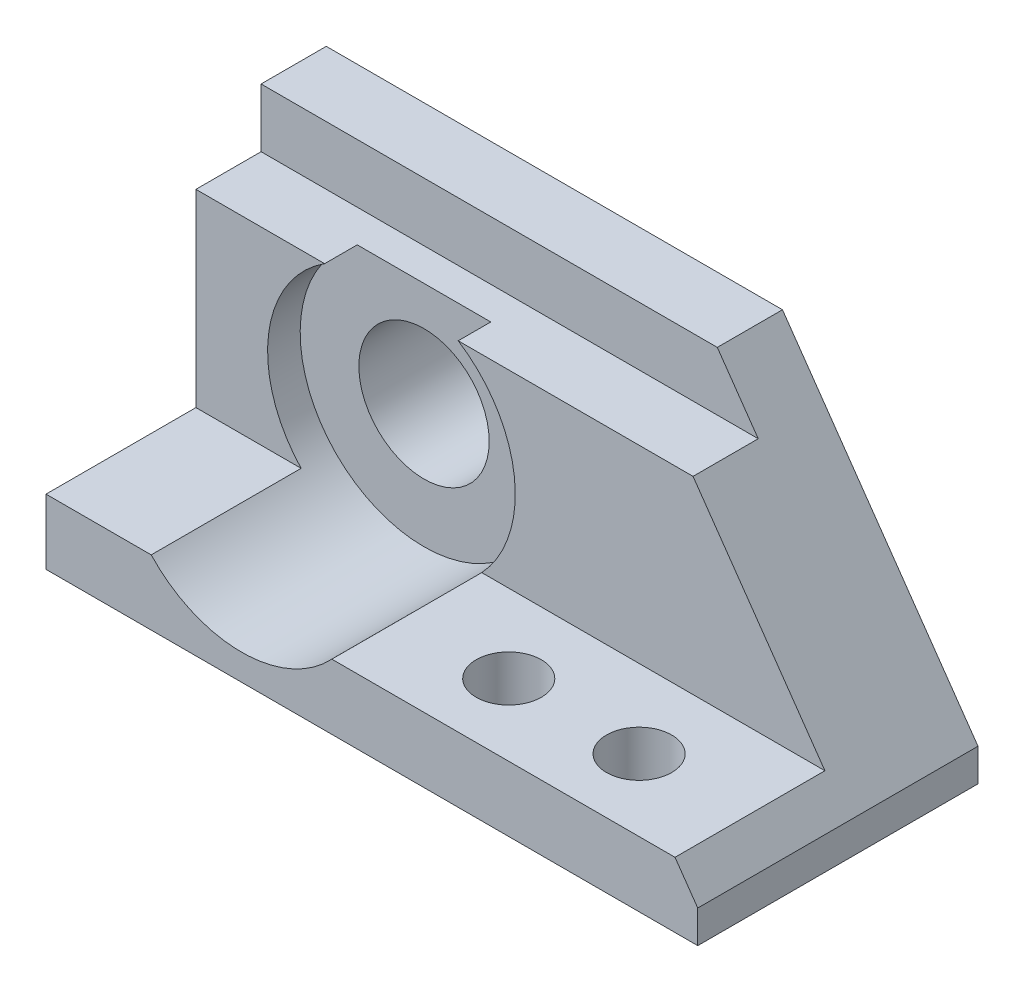
ISO-10303-21;
HEADER;
FILE_DESCRIPTION(('STEP AP214'),'2;1');
FILE_NAME('part.step','',(''),(''),'','','');
FILE_SCHEMA(('AUTOMOTIVE_DESIGN { 1 0 10303 214 1 1 1 1 }'));
ENDSEC;
DATA;
#1=APPLICATION_CONTEXT('core data for automotive mechanical design processes');
#2=APPLICATION_PROTOCOL_DEFINITION('international standard','automotive_design',2000,#1);
#3=PRODUCT_CONTEXT('',#1,'mechanical');
#4=PRODUCT('Part','Part','',(#3));
#5=PRODUCT_RELATED_PRODUCT_CATEGORY('part','',(#4));
#6=PRODUCT_DEFINITION_FORMATION('','',#4);
#7=PRODUCT_DEFINITION_CONTEXT('part definition',#1,'design');
#8=PRODUCT_DEFINITION('design','',#6,#7);
#9=PRODUCT_DEFINITION_SHAPE('','',#8);
#10=(LENGTH_UNIT() NAMED_UNIT(*) SI_UNIT(.MILLI.,.METRE.));
#11=(NAMED_UNIT(*) PLANE_ANGLE_UNIT() SI_UNIT($,.RADIAN.));
#12=(NAMED_UNIT(*) SI_UNIT($,.STERADIAN.) SOLID_ANGLE_UNIT());
#13=UNCERTAINTY_MEASURE_WITH_UNIT(LENGTH_MEASURE(1.E-05),#10,'distance_accuracy_value','');
#14=(GEOMETRIC_REPRESENTATION_CONTEXT(3) GLOBAL_UNCERTAINTY_ASSIGNED_CONTEXT((#13)) GLOBAL_UNIT_ASSIGNED_CONTEXT((#10,
#11,#12)) REPRESENTATION_CONTEXT('',''));
#15=CARTESIAN_POINT('',(0.,0.,0.));
#16=DIRECTION('',(0.,0.,1.));
#17=DIRECTION('',(1.,0.,0.));
#18=AXIS2_PLACEMENT_3D('',#15,#16,#17);
#19=CARTESIAN_POINT('',(100.,39.,20.));
#20=DIRECTION('',(0.,-1.,0.));
#21=DIRECTION('',(0.,0.,-1.));
#22=AXIS2_PLACEMENT_3D('',#19,#20,#21);
#23=PLANE('',#22);
#24=DIRECTION('',(0.,0.,1.));
#25=VECTOR('',#24,1.);
#26=CARTESIAN_POINT('',(40.2469507659596,39.,15.));
#27=LINE('',#26,#25);
#28=CARTESIAN_POINT('',(40.2469507659596,39.,20.));
#29=VERTEX_POINT('',#28);
#30=CARTESIAN_POINT('',(40.2469507659596,39.,15.));
#31=VERTEX_POINT('',#30);
#32=EDGE_CURVE('E141',#29,#31,#27,.F.);
#33=ORIENTED_EDGE('',*,*,#32,.F.);
#34=DIRECTION('',(-1.,0.,0.));
#35=VECTOR('',#34,1.);
#36=CARTESIAN_POINT('',(100.,39.,20.));
#37=LINE('',#36,#35);
#38=CARTESIAN_POINT('',(76.2790697674419,39.,20.));
#39=VERTEX_POINT('',#38);
#40=EDGE_CURVE('E219',#39,#29,#37,.T.);
#41=ORIENTED_EDGE('',*,*,#40,.F.);
#42=DIRECTION('',(0.,0.,1.));
#43=VECTOR('',#42,1.);
#44=CARTESIAN_POINT('',(76.2790697674419,39.,20.));
#45=LINE('',#44,#43);
#46=CARTESIAN_POINT('',(76.2790697674419,39.,10.));
#47=VERTEX_POINT('',#46);
#48=EDGE_CURVE('E171',#47,#39,#45,.T.);
#49=ORIENTED_EDGE('',*,*,#48,.F.);
#50=DIRECTION('',(-1.,0.,0.));
#51=VECTOR('',#50,1.);
#52=CARTESIAN_POINT('',(100.,39.,10.));
#53=LINE('',#52,#51);
#54=CARTESIAN_POINT('',(0.,39.,10.));
#55=VERTEX_POINT('',#54);
#56=EDGE_CURVE('E222',#47,#55,#53,.T.);
#57=ORIENTED_EDGE('',*,*,#56,.T.);
#58=DIRECTION('',(0.,0.,1.));
#59=VECTOR('',#58,1.);
#60=CARTESIAN_POINT('',(0.,39.,20.));
#61=LINE('',#60,#59);
#62=CARTESIAN_POINT('',(0.,39.,20.));
#63=VERTEX_POINT('',#62);
#64=EDGE_CURVE('E190',#55,#63,#61,.T.);
#65=ORIENTED_EDGE('',*,*,#64,.T.);
#66=CARTESIAN_POINT('',(19.7530492340404,39.,20.));
#67=VERTEX_POINT('',#66);
#68=EDGE_CURVE('E146',#67,#63,#37,.T.);
#69=ORIENTED_EDGE('',*,*,#68,.F.);
#70=DIRECTION('',(0.,0.,1.));
#71=VECTOR('',#70,1.);
#72=CARTESIAN_POINT('',(19.7530492340404,39.,15.));
#73=LINE('',#72,#71);
#74=CARTESIAN_POINT('',(19.7530492340404,39.,15.));
#75=VERTEX_POINT('',#74);
#76=EDGE_CURVE('E139',#75,#67,#73,.T.);
#77=ORIENTED_EDGE('',*,*,#76,.F.);
#78=DIRECTION('',(1.,0.,0.));
#79=VECTOR('',#78,1.);
#80=CARTESIAN_POINT('',(100.,39.,15.));
#81=LINE('',#80,#79);
#82=EDGE_CURVE('E11',#75,#31,#81,.T.);
#83=ORIENTED_EDGE('',*,*,#82,.T.);
#84=EDGE_LOOP('',(#33,#41,#49,#57,#65,#69,#77,#83));
#85=FACE_BOUND('',#84,.T.);
#86=ADVANCED_FACE('F37',(#85),#23,.F.);
#87=CARTESIAN_POINT('',(100.,10.,20.));
#88=DIRECTION('',(0.,0.,-1.));
#89=DIRECTION('',(-1.,0.,0.));
#90=AXIS2_PLACEMENT_3D('',#87,#88,#89);
#91=PLANE('',#90);
#92=CARTESIAN_POINT('',(30.,23.,20.));
#93=DIRECTION('',(0.,0.,-1.));
#94=DIRECTION('',(-1.,0.,0.));
#95=AXIS2_PLACEMENT_3D('',#92,#93,#94);
#96=CIRCLE('',#95,19.);
#97=CARTESIAN_POINT('',(43.856406460551,10.,20.));
#98=VERTEX_POINT('',#97);
#99=EDGE_CURVE('E150',#98,#29,#96,.F.);
#100=ORIENTED_EDGE('',*,*,#99,.F.);
#101=DIRECTION('',(-1.,0.,0.));
#102=VECTOR('',#101,1.);
#103=CARTESIAN_POINT('',(100.,10.,20.));
#104=LINE('',#103,#102);
#105=CARTESIAN_POINT('',(96.5116279069767,10.,20.));
#106=VERTEX_POINT('',#105);
#107=EDGE_CURVE('E216',#106,#98,#104,.T.);
#108=ORIENTED_EDGE('',*,*,#107,.F.);
#109=DIRECTION('',(0.572181596024081,-0.820126954301183,0.));
#110=VECTOR('',#109,1.);
#111=CARTESIAN_POINT('',(97.6536922517279,8.36304110585667,20.));
#112=LINE('',#111,#110);
#113=EDGE_CURVE('E168',#39,#106,#112,.T.);
#114=ORIENTED_EDGE('',*,*,#113,.F.);
#115=ORIENTED_EDGE('',*,*,#40,.T.);
#116=EDGE_LOOP('',(#100,#108,#114,#115));
#117=FACE_BOUND('',#116,.T.);
#118=ADVANCED_FACE('F256',(#117),#91,.F.);
#119=CARTESIAN_POINT('',(100.,10.,43.));
#120=DIRECTION('',(0.,-1.,0.));
#121=DIRECTION('',(0.,0.,-1.));
#122=AXIS2_PLACEMENT_3D('',#119,#120,#121);
#123=PLANE('',#122);
#124=CARTESIAN_POINT('',(80.,10.,32.));
#125=DIRECTION('',(0.,1.,0.));
#126=DIRECTION('',(0.,0.,1.));
#127=AXIS2_PLACEMENT_3D('',#124,#125,#126);
#128=CIRCLE('',#127,4.99999999999999);
#129=CARTESIAN_POINT('',(80.,10.,37.));
#130=VERTEX_POINT('',#129);
#131=EDGE_CURVE('E473',#130,#130,#128,.T.);
#132=ORIENTED_EDGE('',*,*,#131,.F.);
#133=EDGE_LOOP('',(#132));
#134=FACE_BOUND('',#133,.T.);
#135=CARTESIAN_POINT('',(60.,10.,32.));
#136=DIRECTION('',(0.,1.,0.));
#137=DIRECTION('',(0.,0.,1.));
#138=AXIS2_PLACEMENT_3D('',#135,#136,#137);
#139=CIRCLE('',#138,4.99999999999999);
#140=CARTESIAN_POINT('',(60.,10.,37.));
#141=VERTEX_POINT('',#140);
#142=EDGE_CURVE('E458',#141,#141,#139,.T.);
#143=ORIENTED_EDGE('',*,*,#142,.F.);
#144=EDGE_LOOP('',(#143));
#145=FACE_BOUND('',#144,.T.);
#146=DIRECTION('',(0.,0.,1.));
#147=VECTOR('',#146,1.);
#148=CARTESIAN_POINT('',(43.856406460551,10.,15.));
#149=LINE('',#148,#147);
#150=CARTESIAN_POINT('',(43.856406460551,10.,43.));
#151=VERTEX_POINT('',#150);
#152=EDGE_CURVE('E147',#151,#98,#149,.F.);
#153=ORIENTED_EDGE('',*,*,#152,.F.);
#154=DIRECTION('',(-1.,0.,0.));
#155=VECTOR('',#154,1.);
#156=CARTESIAN_POINT('',(100.,10.,43.));
#157=LINE('',#156,#155);
#158=CARTESIAN_POINT('',(96.5116279069767,10.,43.));
#159=VERTEX_POINT('',#158);
#160=EDGE_CURVE('E212',#159,#151,#157,.T.);
#161=ORIENTED_EDGE('',*,*,#160,.F.);
#162=DIRECTION('',(0.,0.,1.));
#163=VECTOR('',#162,1.);
#164=CARTESIAN_POINT('',(96.5116279069767,10.,43.));
#165=LINE('',#164,#163);
#166=EDGE_CURVE('E165',#106,#159,#165,.T.);
#167=ORIENTED_EDGE('',*,*,#166,.F.);
#168=ORIENTED_EDGE('',*,*,#107,.T.);
#169=EDGE_LOOP('',(#153,#161,#167,#168));
#170=FACE_BOUND('',#169,.T.);
#171=ADVANCED_FACE('F259',(#134,#145,#170),#123,.F.);
#172=DIRECTION('',(0.,0.,1.));
#173=VECTOR('',#172,1.);
#174=CARTESIAN_POINT('',(16.143593539449,10.,15.));
#175=LINE('',#174,#173);
#176=CARTESIAN_POINT('',(16.143593539449,10.,20.));
#177=VERTEX_POINT('',#176);
#178=CARTESIAN_POINT('',(16.143593539449,10.,43.));
#179=VERTEX_POINT('',#178);
#180=EDGE_CURVE('E52',#177,#179,#175,.T.);
#181=ORIENTED_EDGE('',*,*,#180,.F.);
#182=CARTESIAN_POINT('',(0.,10.,20.));
#183=VERTEX_POINT('',#182);
#184=EDGE_CURVE('E215',#177,#183,#104,.T.);
#185=ORIENTED_EDGE('',*,*,#184,.T.);
#186=DIRECTION('',(0.,0.,1.));
#187=VECTOR('',#186,1.);
#188=CARTESIAN_POINT('',(0.,10.,43.));
#189=LINE('',#188,#187);
#190=CARTESIAN_POINT('',(0.,10.,43.));
#191=VERTEX_POINT('',#190);
#192=EDGE_CURVE('E195',#183,#191,#189,.T.);
#193=ORIENTED_EDGE('',*,*,#192,.T.);
#194=EDGE_CURVE('E211',#179,#191,#157,.T.);
#195=ORIENTED_EDGE('',*,*,#194,.F.);
#196=EDGE_LOOP('',(#181,#185,#193,#195));
#197=FACE_BOUND('',#196,.T.);
#198=ADVANCED_FACE('F265',(#197),#123,.F.);
#199=CARTESIAN_POINT('',(100.,0.,0.));
#200=DIRECTION('',(-1.,0.,0.));
#201=DIRECTION('',(0.,0.,1.));
#202=AXIS2_PLACEMENT_3D('',#199,#200,#201);
#203=PLANE('',#202);
#204=DIRECTION('',(0.,0.,-1.));
#205=VECTOR('',#204,1.);
#206=CARTESIAN_POINT('',(100.,5.,161.207977257442));
#207=LINE('',#206,#205);
#208=CARTESIAN_POINT('',(100.,4.99999999999998,43.));
#209=VERTEX_POINT('',#208);
#210=CARTESIAN_POINT('',(100.,5.,0.));
#211=VERTEX_POINT('',#210);
#212=EDGE_CURVE('E157',#209,#211,#207,.T.);
#213=ORIENTED_EDGE('',*,*,#212,.F.);
#214=DIRECTION('',(0.,-1.,0.));
#215=VECTOR('',#214,1.);
#216=CARTESIAN_POINT('',(100.,0.,43.));
#217=LINE('',#216,#215);
#218=CARTESIAN_POINT('',(100.,0.,43.));
#219=VERTEX_POINT('',#218);
#220=EDGE_CURVE('E176',#209,#219,#217,.T.);
#221=ORIENTED_EDGE('',*,*,#220,.T.);
#222=DIRECTION('',(0.,0.,-1.));
#223=VECTOR('',#222,1.);
#224=CARTESIAN_POINT('',(100.,0.,0.));
#225=LINE('',#224,#223);
#226=CARTESIAN_POINT('',(100.,0.,0.));
#227=VERTEX_POINT('',#226);
#228=EDGE_CURVE('E178',#219,#227,#225,.T.);
#229=ORIENTED_EDGE('',*,*,#228,.T.);
#230=DIRECTION('',(0.,1.,0.));
#231=VECTOR('',#230,1.);
#232=CARTESIAN_POINT('',(100.,48.,0.));
#233=LINE('',#232,#231);
#234=EDGE_CURVE('E181',#227,#211,#233,.T.);
#235=ORIENTED_EDGE('',*,*,#234,.T.);
#236=EDGE_LOOP('',(#213,#221,#229,#235));
#237=FACE_BOUND('',#236,.T.);
#238=ADVANCED_FACE('F233',(#237),#203,.F.);
#239=CARTESIAN_POINT('',(100.,39.,10.));
#240=DIRECTION('',(0.,0.,-1.));
#241=DIRECTION('',(-1.,0.,0.));
#242=AXIS2_PLACEMENT_3D('',#239,#240,#241);
#243=PLANE('',#242);
#244=DIRECTION('',(0.572181596024081,-0.820126954301183,0.));
#245=VECTOR('',#244,1.);
#246=CARTESIAN_POINT('',(84.0451073117497,27.8686795198254,10.));
#247=LINE('',#246,#245);
#248=CARTESIAN_POINT('',(70.,48.,10.));
#249=VERTEX_POINT('',#248);
#250=EDGE_CURVE('E60',#249,#47,#247,.T.);
#251=ORIENTED_EDGE('',*,*,#250,.F.);
#252=DIRECTION('',(-1.,0.,0.));
#253=VECTOR('',#252,1.);
#254=CARTESIAN_POINT('',(100.,48.,10.));
#255=LINE('',#254,#253);
#256=CARTESIAN_POINT('',(0.,48.,10.));
#257=VERTEX_POINT('',#256);
#258=EDGE_CURVE('E224',#249,#257,#255,.T.);
#259=ORIENTED_EDGE('',*,*,#258,.T.);
#260=DIRECTION('',(0.,-1.,0.));
#261=VECTOR('',#260,1.);
#262=CARTESIAN_POINT('',(0.,39.,10.));
#263=LINE('',#262,#261);
#264=EDGE_CURVE('E187',#257,#55,#263,.T.);
#265=ORIENTED_EDGE('',*,*,#264,.T.);
#266=ORIENTED_EDGE('',*,*,#56,.F.);
#267=EDGE_LOOP('',(#251,#259,#265,#266));
#268=FACE_BOUND('',#267,.T.);
#269=ADVANCED_FACE('F249',(#268),#243,.F.);
#270=EDGE_CURVE('E148',#67,#177,#96,.F.);
#271=ORIENTED_EDGE('',*,*,#270,.F.);
#272=ORIENTED_EDGE('',*,*,#68,.T.);
#273=DIRECTION('',(0.,-1.,0.));
#274=VECTOR('',#273,1.);
#275=CARTESIAN_POINT('',(0.,10.,20.));
#276=LINE('',#275,#274);
#277=EDGE_CURVE('E192',#63,#183,#276,.T.);
#278=ORIENTED_EDGE('',*,*,#277,.T.);
#279=ORIENTED_EDGE('',*,*,#184,.F.);
#280=EDGE_LOOP('',(#271,#272,#278,#279));
#281=FACE_BOUND('',#280,.T.);
#282=ADVANCED_FACE('F268',(#281),#91,.F.);
#283=CARTESIAN_POINT('',(100.,0.,43.));
#284=DIRECTION('',(0.,0.,-1.));
#285=DIRECTION('',(-1.,0.,0.));
#286=AXIS2_PLACEMENT_3D('',#283,#284,#285);
#287=PLANE('',#286);
#288=CARTESIAN_POINT('',(30.,23.,43.));
#289=DIRECTION('',(0.,0.,-1.));
#290=DIRECTION('',(-1.,0.,0.));
#291=AXIS2_PLACEMENT_3D('',#288,#289,#290);
#292=CIRCLE('',#291,19.);
#293=EDGE_CURVE('E142',#151,#179,#292,.T.);
#294=ORIENTED_EDGE('',*,*,#293,.T.);
#295=ORIENTED_EDGE('',*,*,#194,.T.);
#296=DIRECTION('',(0.,-1.,0.));
#297=VECTOR('',#296,1.);
#298=CARTESIAN_POINT('',(0.,0.,43.));
#299=LINE('',#298,#297);
#300=CARTESIAN_POINT('',(0.,0.,43.));
#301=VERTEX_POINT('',#300);
#302=EDGE_CURVE('E198',#191,#301,#299,.T.);
#303=ORIENTED_EDGE('',*,*,#302,.T.);
#304=DIRECTION('',(-1.,0.,0.));
#305=VECTOR('',#304,1.);
#306=CARTESIAN_POINT('',(100.,0.,43.));
#307=LINE('',#306,#305);
#308=EDGE_CURVE('E208',#219,#301,#307,.T.);
#309=ORIENTED_EDGE('',*,*,#308,.F.);
#310=ORIENTED_EDGE('',*,*,#220,.F.);
#311=DIRECTION('',(0.572181596024081,-0.820126954301183,0.));
#312=VECTOR('',#311,1.);
#313=CARTESIAN_POINT('',(102.346307748272,1.63695889414332,43.));
#314=LINE('',#313,#312);
#315=EDGE_CURVE('E160',#159,#209,#314,.T.);
#316=ORIENTED_EDGE('',*,*,#315,.F.);
#317=ORIENTED_EDGE('',*,*,#160,.T.);
#318=EDGE_LOOP('',(#294,#295,#303,#309,#310,#316,#317));
#319=FACE_BOUND('',#318,.T.);
#320=ADVANCED_FACE('F262',(#319),#287,.F.);
#321=CARTESIAN_POINT('',(100.,48.,0.));
#322=DIRECTION('',(0.,0.,1.));
#323=DIRECTION('',(1.,0.,0.));
#324=AXIS2_PLACEMENT_3D('',#321,#322,#323);
#325=PLANE('',#324);
#326=CARTESIAN_POINT('',(30.,23.,0.));
#327=DIRECTION('',(0.,0.,1.));
#328=DIRECTION('',(1.,0.,0.));
#329=AXIS2_PLACEMENT_3D('',#326,#327,#328);
#330=CIRCLE('',#329,9.99999999999999);
#331=CARTESIAN_POINT('',(40.,23.,0.));
#332=VERTEX_POINT('',#331);
#333=EDGE_CURVE('E461',#332,#332,#330,.T.);
#334=ORIENTED_EDGE('',*,*,#333,.T.);
#335=EDGE_LOOP('',(#334));
#336=FACE_BOUND('',#335,.T.);
#337=DIRECTION('',(-0.572181596024081,0.820126954301183,0.));
#338=VECTOR('',#337,1.);
#339=CARTESIAN_POINT('',(79.82175336486,33.9221535103674,0.));
#340=LINE('',#339,#338);
#341=CARTESIAN_POINT('',(70.,48.,0.));
#342=VERTEX_POINT('',#341);
#343=EDGE_CURVE('E45',#211,#342,#340,.T.);
#344=ORIENTED_EDGE('',*,*,#343,.F.);
#345=ORIENTED_EDGE('',*,*,#234,.F.);
#346=DIRECTION('',(-1.,0.,0.));
#347=VECTOR('',#346,1.);
#348=CARTESIAN_POINT('',(100.,0.,0.));
#349=LINE('',#348,#347);
#350=CARTESIAN_POINT('',(0.,0.,0.));
#351=VERTEX_POINT('',#350);
#352=EDGE_CURVE('E205',#227,#351,#349,.T.);
#353=ORIENTED_EDGE('',*,*,#352,.T.);
#354=DIRECTION('',(0.,1.,0.));
#355=VECTOR('',#354,1.);
#356=CARTESIAN_POINT('',(0.,48.,0.));
#357=LINE('',#356,#355);
#358=CARTESIAN_POINT('',(0.,48.,0.));
#359=VERTEX_POINT('',#358);
#360=EDGE_CURVE('E179',#351,#359,#357,.T.);
#361=ORIENTED_EDGE('',*,*,#360,.T.);
#362=DIRECTION('',(-1.,0.,0.));
#363=VECTOR('',#362,1.);
#364=CARTESIAN_POINT('',(100.,48.,0.));
#365=LINE('',#364,#363);
#366=EDGE_CURVE('E184',#342,#359,#365,.T.);
#367=ORIENTED_EDGE('',*,*,#366,.F.);
#368=EDGE_LOOP('',(#344,#345,#353,#361,#367));
#369=FACE_BOUND('',#368,.T.);
#370=ADVANCED_FACE('F231',(#336,#369),#325,.F.);
#371=CARTESIAN_POINT('',(100.,48.,10.));
#372=DIRECTION('',(0.,-1.,0.));
#373=DIRECTION('',(0.,0.,-1.));
#374=AXIS2_PLACEMENT_3D('',#371,#372,#373);
#375=PLANE('',#374);
#376=ORIENTED_EDGE('',*,*,#258,.F.);
#377=DIRECTION('',(0.,0.,-1.));
#378=VECTOR('',#377,1.);
#379=CARTESIAN_POINT('',(70.,48.,161.207977257442));
#380=LINE('',#379,#378);
#381=EDGE_CURVE('E156',#249,#342,#380,.T.);
#382=ORIENTED_EDGE('',*,*,#381,.T.);
#383=ORIENTED_EDGE('',*,*,#366,.T.);
#384=DIRECTION('',(0.,0.,1.));
#385=VECTOR('',#384,1.);
#386=CARTESIAN_POINT('',(0.,48.,10.));
#387=LINE('',#386,#385);
#388=EDGE_CURVE('E175',#359,#257,#387,.T.);
#389=ORIENTED_EDGE('',*,*,#388,.T.);
#390=EDGE_LOOP('',(#376,#382,#383,#389));
#391=FACE_BOUND('',#390,.T.);
#392=ADVANCED_FACE('F39',(#391),#375,.F.);
#393=CARTESIAN_POINT('',(100.,0.,0.));
#394=DIRECTION('',(0.,1.,0.));
#395=DIRECTION('',(0.,0.,1.));
#396=AXIS2_PLACEMENT_3D('',#393,#394,#395);
#397=PLANE('',#396);
#398=CARTESIAN_POINT('',(80.,0.,32.));
#399=DIRECTION('',(0.,1.,0.));
#400=DIRECTION('',(0.,0.,1.));
#401=AXIS2_PLACEMENT_3D('',#398,#399,#400);
#402=CIRCLE('',#401,4.99999999999999);
#403=CARTESIAN_POINT('',(80.,0.,37.));
#404=VERTEX_POINT('',#403);
#405=EDGE_CURVE('E453',#404,#404,#402,.T.);
#406=ORIENTED_EDGE('',*,*,#405,.T.);
#407=EDGE_LOOP('',(#406));
#408=FACE_BOUND('',#407,.T.);
#409=CARTESIAN_POINT('',(60.,0.,32.));
#410=DIRECTION('',(0.,1.,0.));
#411=DIRECTION('',(0.,0.,1.));
#412=AXIS2_PLACEMENT_3D('',#409,#410,#411);
#413=CIRCLE('',#412,4.99999999999999);
#414=CARTESIAN_POINT('',(60.,0.,37.));
#415=VERTEX_POINT('',#414);
#416=EDGE_CURVE('E456',#415,#415,#413,.T.);
#417=ORIENTED_EDGE('',*,*,#416,.T.);
#418=EDGE_LOOP('',(#417));
#419=FACE_BOUND('',#418,.T.);
#420=DIRECTION('',(0.,0.,-1.));
#421=VECTOR('',#420,1.);
#422=CARTESIAN_POINT('',(0.,0.,0.));
#423=LINE('',#422,#421);
#424=EDGE_CURVE('E200',#301,#351,#423,.T.);
#425=ORIENTED_EDGE('',*,*,#424,.T.);
#426=ORIENTED_EDGE('',*,*,#352,.F.);
#427=ORIENTED_EDGE('',*,*,#228,.F.);
#428=ORIENTED_EDGE('',*,*,#308,.T.);
#429=EDGE_LOOP('',(#425,#426,#427,#428));
#430=FACE_BOUND('',#429,.T.);
#431=ADVANCED_FACE('F239',(#408,#419,#430),#397,.F.);
#432=CARTESIAN_POINT('',(0.,0.,0.));
#433=DIRECTION('',(-1.,0.,0.));
#434=DIRECTION('',(0.,0.,1.));
#435=AXIS2_PLACEMENT_3D('',#432,#433,#434);
#436=PLANE('',#435);
#437=ORIENTED_EDGE('',*,*,#388,.F.);
#438=ORIENTED_EDGE('',*,*,#360,.F.);
#439=ORIENTED_EDGE('',*,*,#424,.F.);
#440=ORIENTED_EDGE('',*,*,#302,.F.);
#441=ORIENTED_EDGE('',*,*,#192,.F.);
#442=ORIENTED_EDGE('',*,*,#277,.F.);
#443=ORIENTED_EDGE('',*,*,#64,.F.);
#444=ORIENTED_EDGE('',*,*,#264,.F.);
#445=EDGE_LOOP('',(#437,#438,#439,#440,#441,#442,#443,#444));
#446=FACE_BOUND('',#445,.T.);
#447=ADVANCED_FACE('F244',(#446),#436,.T.);
#448=CARTESIAN_POINT('',(70.,48.,161.207977257442));
#449=DIRECTION('',(0.820126954301183,0.572181596024081,0.));
#450=DIRECTION('',(-0.572181596024081,0.820126954301183,0.));
#451=AXIS2_PLACEMENT_3D('',#448,#449,#450);
#452=PLANE('',#451);
#453=ORIENTED_EDGE('',*,*,#381,.F.);
#454=ORIENTED_EDGE('',*,*,#250,.T.);
#455=ORIENTED_EDGE('',*,*,#48,.T.);
#456=ORIENTED_EDGE('',*,*,#113,.T.);
#457=ORIENTED_EDGE('',*,*,#166,.T.);
#458=ORIENTED_EDGE('',*,*,#315,.T.);
#459=ORIENTED_EDGE('',*,*,#212,.T.);
#460=ORIENTED_EDGE('',*,*,#343,.T.);
#461=EDGE_LOOP('',(#453,#454,#455,#456,#457,#458,#459,#460));
#462=FACE_BOUND('',#461,.T.);
#463=ADVANCED_FACE('F228',(#462),#452,.T.);
#464=CARTESIAN_POINT('',(30.,23.,15.));
#465=DIRECTION('',(0.,0.,-1.));
#466=DIRECTION('',(-1.,0.,0.));
#467=AXIS2_PLACEMENT_3D('',#464,#465,#466);
#468=PLANE('',#467);
#469=CARTESIAN_POINT('',(30.,23.,15.));
#470=DIRECTION('',(0.,0.,1.));
#471=DIRECTION('',(1.,0.,0.));
#472=AXIS2_PLACEMENT_3D('',#469,#470,#471);
#473=CIRCLE('',#472,9.99999999999999);
#474=CARTESIAN_POINT('',(40.,23.,15.));
#475=VERTEX_POINT('',#474);
#476=EDGE_CURVE('E457',#475,#475,#473,.T.);
#477=ORIENTED_EDGE('',*,*,#476,.F.);
#478=EDGE_LOOP('',(#477));
#479=FACE_BOUND('',#478,.T.);
#480=CARTESIAN_POINT('',(30.,23.,15.));
#481=DIRECTION('',(0.,0.,-1.));
#482=DIRECTION('',(-1.,0.,0.));
#483=AXIS2_PLACEMENT_3D('',#480,#481,#482);
#484=CIRCLE('',#483,19.);
#485=EDGE_CURVE('E134',#31,#75,#484,.T.);
#486=ORIENTED_EDGE('',*,*,#485,.F.);
#487=ORIENTED_EDGE('',*,*,#82,.F.);
#488=EDGE_LOOP('',(#486,#487));
#489=FACE_BOUND('',#488,.T.);
#490=ADVANCED_FACE('F133',(#479,#489),#468,.F.);
#491=CARTESIAN_POINT('',(30.,23.,15.));
#492=DIRECTION('',(0.,0.,1.));
#493=DIRECTION('',(1.,0.,0.));
#494=AXIS2_PLACEMENT_3D('',#491,#492,#493);
#495=CYLINDRICAL_SURFACE('',#494,19.);
#496=ORIENTED_EDGE('',*,*,#32,.T.);
#497=ORIENTED_EDGE('',*,*,#485,.T.);
#498=ORIENTED_EDGE('',*,*,#76,.T.);
#499=ORIENTED_EDGE('',*,*,#270,.T.);
#500=ORIENTED_EDGE('',*,*,#180,.T.);
#501=ORIENTED_EDGE('',*,*,#293,.F.);
#502=ORIENTED_EDGE('',*,*,#152,.T.);
#503=ORIENTED_EDGE('',*,*,#99,.T.);
#504=EDGE_LOOP('',(#496,#497,#498,#499,#500,#501,#502,#503));
#505=FACE_BOUND('',#504,.T.);
#506=ADVANCED_FACE('F138',(#505),#495,.F.);
#507=CARTESIAN_POINT('',(30.,23.,15.));
#508=DIRECTION('',(0.,0.,1.));
#509=DIRECTION('',(1.,0.,0.));
#510=AXIS2_PLACEMENT_3D('',#507,#508,#509);
#511=CYLINDRICAL_SURFACE('',#510,9.99999999999999);
#512=ORIENTED_EDGE('',*,*,#333,.F.);
#513=EDGE_LOOP('',(#512));
#514=FACE_BOUND('',#513,.T.);
#515=ORIENTED_EDGE('',*,*,#476,.T.);
#516=EDGE_LOOP('',(#515));
#517=FACE_BOUND('',#516,.T.);
#518=ADVANCED_FACE('F350',(#514,#517),#511,.F.);
#519=CARTESIAN_POINT('',(60.,10.,32.));
#520=DIRECTION('',(0.,1.,0.));
#521=DIRECTION('',(0.,0.,1.));
#522=AXIS2_PLACEMENT_3D('',#519,#520,#521);
#523=CYLINDRICAL_SURFACE('',#522,4.99999999999999);
#524=ORIENTED_EDGE('',*,*,#416,.F.);
#525=EDGE_LOOP('',(#524));
#526=FACE_BOUND('',#525,.T.);
#527=ORIENTED_EDGE('',*,*,#142,.T.);
#528=EDGE_LOOP('',(#527));
#529=FACE_BOUND('',#528,.T.);
#530=ADVANCED_FACE('F357',(#526,#529),#523,.F.);
#531=CARTESIAN_POINT('',(80.,10.,32.));
#532=DIRECTION('',(0.,1.,0.));
#533=DIRECTION('',(0.,0.,1.));
#534=AXIS2_PLACEMENT_3D('',#531,#532,#533);
#535=CYLINDRICAL_SURFACE('',#534,4.99999999999999);
#536=ORIENTED_EDGE('',*,*,#405,.F.);
#537=EDGE_LOOP('',(#536));
#538=FACE_BOUND('',#537,.T.);
#539=ORIENTED_EDGE('',*,*,#131,.T.);
#540=EDGE_LOOP('',(#539));
#541=FACE_BOUND('',#540,.T.);
#542=ADVANCED_FACE('F365',(#538,#541),#535,.F.);
#543=CLOSED_SHELL('',(#86,#118,#171,#198,#238,#269,#282,#320,#370,#392,#431,#447,#463,#490,#506,
#518,#530,#542));
#544=MANIFOLD_SOLID_BREP('B2',#543);
#545=ADVANCED_BREP_SHAPE_REPRESENTATION('',(#18,#544),#14);
#546=SHAPE_DEFINITION_REPRESENTATION(#9,#545);
ENDSEC;
END-ISO-10303-21;
